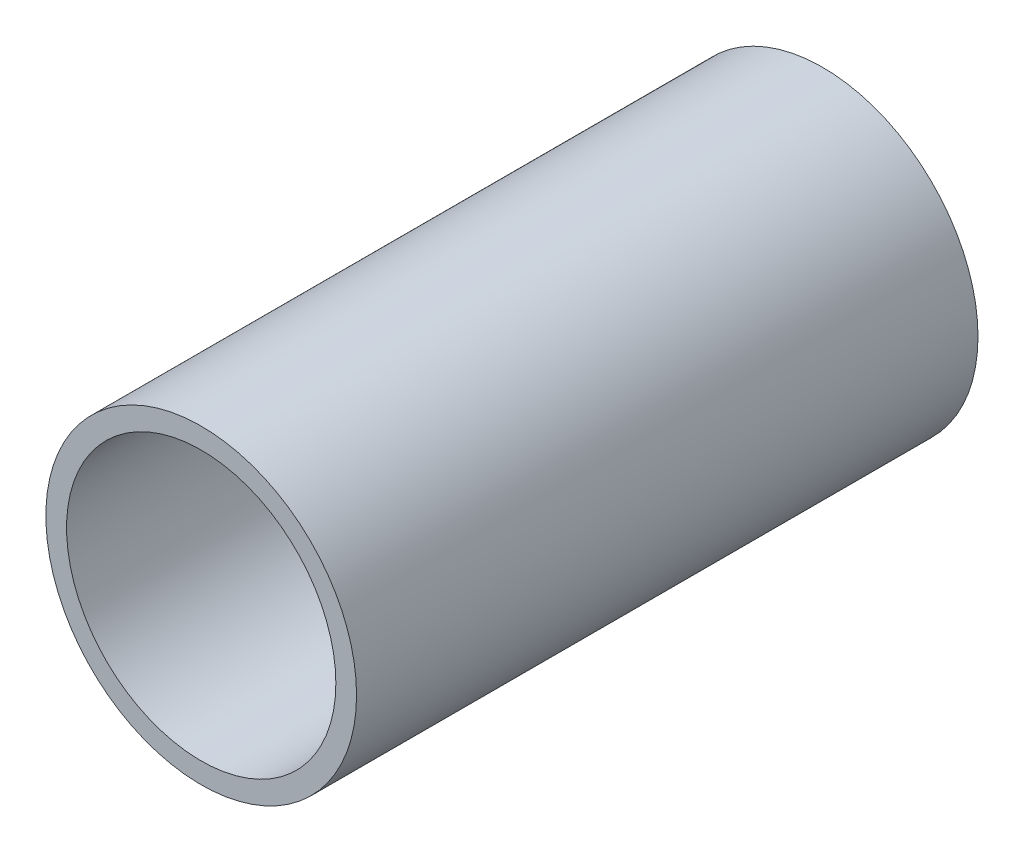
ISO-10303-21;
HEADER;
FILE_DESCRIPTION(('STEP AP214'),'2;1');
FILE_NAME('part.step','',(''),(''),'','','');
FILE_SCHEMA(('AUTOMOTIVE_DESIGN { 1 0 10303 214 1 1 1 1 }'));
ENDSEC;
DATA;
#1=APPLICATION_CONTEXT('core data for automotive mechanical design processes');
#2=APPLICATION_PROTOCOL_DEFINITION('international standard','automotive_design',2000,#1);
#3=PRODUCT_CONTEXT('',#1,'mechanical');
#4=PRODUCT('Part','Part','',(#3));
#5=PRODUCT_RELATED_PRODUCT_CATEGORY('part','',(#4));
#6=PRODUCT_DEFINITION_FORMATION('','',#4);
#7=PRODUCT_DEFINITION_CONTEXT('part definition',#1,'design');
#8=PRODUCT_DEFINITION('design','',#6,#7);
#9=PRODUCT_DEFINITION_SHAPE('','',#8);
#10=(LENGTH_UNIT() NAMED_UNIT(*) SI_UNIT(.MILLI.,.METRE.));
#11=(NAMED_UNIT(*) PLANE_ANGLE_UNIT() SI_UNIT($,.RADIAN.));
#12=(NAMED_UNIT(*) SI_UNIT($,.STERADIAN.) SOLID_ANGLE_UNIT());
#13=UNCERTAINTY_MEASURE_WITH_UNIT(LENGTH_MEASURE(1.E-05),#10,'distance_accuracy_value','');
#14=(GEOMETRIC_REPRESENTATION_CONTEXT(3) GLOBAL_UNCERTAINTY_ASSIGNED_CONTEXT((#13)) GLOBAL_UNIT_ASSIGNED_CONTEXT((#10,
#11,#12)) REPRESENTATION_CONTEXT('',''));
#15=CARTESIAN_POINT('',(0.,0.,0.));
#16=DIRECTION('',(0.,0.,1.));
#17=DIRECTION('',(1.,0.,0.));
#18=AXIS2_PLACEMENT_3D('',#15,#16,#17);
#19=CARTESIAN_POINT('',(0.,0.,30.));
#20=DIRECTION('',(0.,0.,1.));
#21=DIRECTION('',(1.,0.,0.));
#22=AXIS2_PLACEMENT_3D('',#19,#20,#21);
#23=PLANE('',#22);
#24=CARTESIAN_POINT('',(0.,0.,30.));
#25=DIRECTION('',(0.,0.,1.));
#26=DIRECTION('',(1.,0.,0.));
#27=AXIS2_PLACEMENT_3D('',#24,#25,#26);
#28=CIRCLE('',#27,7.5);
#29=CARTESIAN_POINT('',(7.5,0.,30.));
#30=VERTEX_POINT('',#29);
#31=EDGE_CURVE('E10',#30,#30,#28,.T.);
#32=ORIENTED_EDGE('',*,*,#31,.T.);
#33=EDGE_LOOP('',(#32));
#34=FACE_BOUND('',#33,.T.);
#35=CARTESIAN_POINT('',(0.,0.,30.));
#36=DIRECTION('',(0.,0.,1.));
#37=DIRECTION('',(1.,0.,0.));
#38=AXIS2_PLACEMENT_3D('',#35,#36,#37);
#39=CIRCLE('',#38,6.5);
#40=CARTESIAN_POINT('',(6.5,0.,30.));
#41=VERTEX_POINT('',#40);
#42=EDGE_CURVE('E42',#41,#41,#39,.T.);
#43=ORIENTED_EDGE('',*,*,#42,.F.);
#44=EDGE_LOOP('',(#43));
#45=FACE_BOUND('',#44,.T.);
#46=ADVANCED_FACE('F31',(#34,#45),#23,.T.);
#47=CARTESIAN_POINT('',(0.,0.,0.));
#48=DIRECTION('',(0.,0.,1.));
#49=DIRECTION('',(1.,0.,0.));
#50=AXIS2_PLACEMENT_3D('',#47,#48,#49);
#51=PLANE('',#50);
#52=CARTESIAN_POINT('',(0.,0.,0.));
#53=DIRECTION('',(0.,0.,1.));
#54=DIRECTION('',(1.,0.,0.));
#55=AXIS2_PLACEMENT_3D('',#52,#53,#54);
#56=CIRCLE('',#55,7.5);
#57=CARTESIAN_POINT('',(7.5,0.,0.));
#58=VERTEX_POINT('',#57);
#59=EDGE_CURVE('E35',#58,#58,#56,.T.);
#60=ORIENTED_EDGE('',*,*,#59,.F.);
#61=EDGE_LOOP('',(#60));
#62=FACE_BOUND('',#61,.T.);
#63=CARTESIAN_POINT('',(0.,0.,0.));
#64=DIRECTION('',(0.,0.,1.));
#65=DIRECTION('',(1.,0.,0.));
#66=AXIS2_PLACEMENT_3D('',#63,#64,#65);
#67=CIRCLE('',#66,6.5);
#68=CARTESIAN_POINT('',(6.5,0.,0.));
#69=VERTEX_POINT('',#68);
#70=EDGE_CURVE('E44',#69,#69,#67,.T.);
#71=ORIENTED_EDGE('',*,*,#70,.T.);
#72=EDGE_LOOP('',(#71));
#73=FACE_BOUND('',#72,.T.);
#74=ADVANCED_FACE('F54',(#62,#73),#51,.F.);
#75=CARTESIAN_POINT('',(0.,0.,30.));
#76=DIRECTION('',(0.,0.,-1.));
#77=DIRECTION('',(-1.,0.,0.));
#78=AXIS2_PLACEMENT_3D('',#75,#76,#77);
#79=CYLINDRICAL_SURFACE('',#78,7.5);
#80=ORIENTED_EDGE('',*,*,#31,.F.);
#81=EDGE_LOOP('',(#80));
#82=FACE_BOUND('',#81,.T.);
#83=ORIENTED_EDGE('',*,*,#59,.T.);
#84=EDGE_LOOP('',(#83));
#85=FACE_BOUND('',#84,.T.);
#86=ADVANCED_FACE('F33',(#82,#85),#79,.T.);
#87=CARTESIAN_POINT('',(0.,0.,30.));
#88=DIRECTION('',(0.,0.,-1.));
#89=DIRECTION('',(-1.,0.,0.));
#90=AXIS2_PLACEMENT_3D('',#87,#88,#89);
#91=CYLINDRICAL_SURFACE('',#90,6.5);
#92=ORIENTED_EDGE('',*,*,#42,.T.);
#93=EDGE_LOOP('',(#92));
#94=FACE_BOUND('',#93,.T.);
#95=ORIENTED_EDGE('',*,*,#70,.F.);
#96=EDGE_LOOP('',(#95));
#97=FACE_BOUND('',#96,.T.);
#98=ADVANCED_FACE('F50',(#94,#97),#91,.F.);
#99=CLOSED_SHELL('',(#46,#74,#86,#98));
#100=MANIFOLD_SOLID_BREP('B2',#99);
#101=ADVANCED_BREP_SHAPE_REPRESENTATION('',(#18,#100),#14);
#102=SHAPE_DEFINITION_REPRESENTATION(#9,#101);
ENDSEC;
END-ISO-10303-21;
